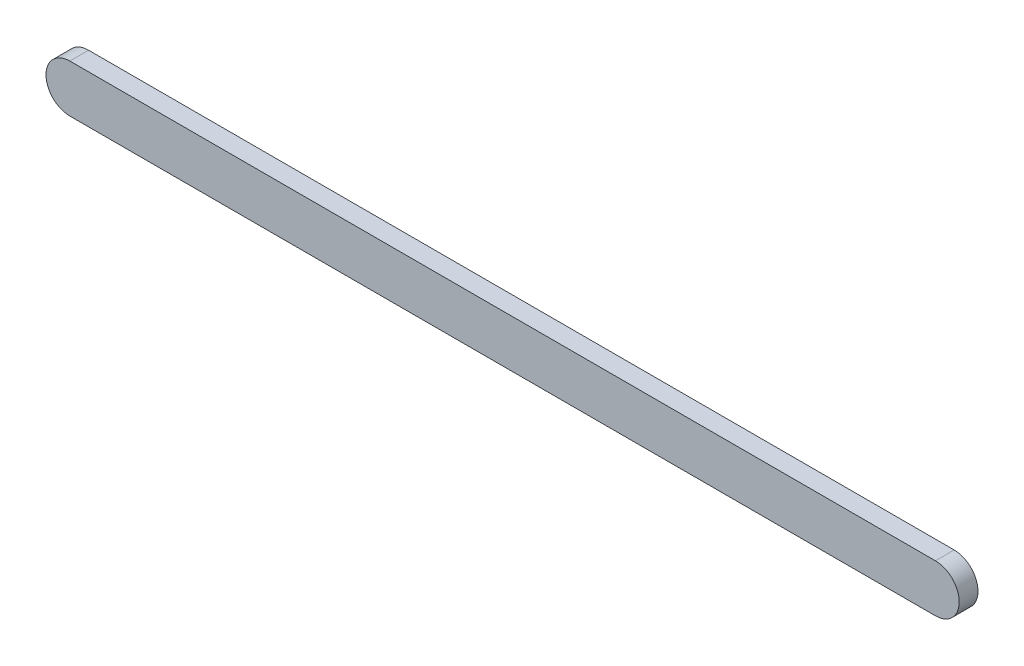
ISO-10303-21;
HEADER;
FILE_DESCRIPTION(('STEP AP214'),'2;1');
FILE_NAME('part.step','',(''),(''),'','','');
FILE_SCHEMA(('AUTOMOTIVE_DESIGN { 1 0 10303 214 1 1 1 1 }'));
ENDSEC;
DATA;
#1=APPLICATION_CONTEXT('core data for automotive mechanical design processes');
#2=APPLICATION_PROTOCOL_DEFINITION('international standard','automotive_design',2000,#1);
#3=PRODUCT_CONTEXT('',#1,'mechanical');
#4=PRODUCT('Part','Part','',(#3));
#5=PRODUCT_RELATED_PRODUCT_CATEGORY('part','',(#4));
#6=PRODUCT_DEFINITION_FORMATION('','',#4);
#7=PRODUCT_DEFINITION_CONTEXT('part definition',#1,'design');
#8=PRODUCT_DEFINITION('design','',#6,#7);
#9=PRODUCT_DEFINITION_SHAPE('','',#8);
#10=(LENGTH_UNIT() NAMED_UNIT(*) SI_UNIT(.MILLI.,.METRE.));
#11=(NAMED_UNIT(*) PLANE_ANGLE_UNIT() SI_UNIT($,.RADIAN.));
#12=(NAMED_UNIT(*) SI_UNIT($,.STERADIAN.) SOLID_ANGLE_UNIT());
#13=UNCERTAINTY_MEASURE_WITH_UNIT(LENGTH_MEASURE(1.E-05),#10,'distance_accuracy_value','');
#14=(GEOMETRIC_REPRESENTATION_CONTEXT(3) GLOBAL_UNCERTAINTY_ASSIGNED_CONTEXT((#13)) GLOBAL_UNIT_ASSIGNED_CONTEXT((#10,
#11,#12)) REPRESENTATION_CONTEXT('',''));
#15=CARTESIAN_POINT('',(0.,0.,0.));
#16=DIRECTION('',(0.,0.,1.));
#17=DIRECTION('',(1.,0.,0.));
#18=AXIS2_PLACEMENT_3D('',#15,#16,#17);
#19=CARTESIAN_POINT('',(95.29358132,52.324,0.));
#20=DIRECTION('',(0.,1.,0.));
#21=DIRECTION('',(1.,0.,0.));
#22=AXIS2_PLACEMENT_3D('',#19,#20,#21);
#23=PLANE('',#22);
#24=DIRECTION('',(1.,0.,0.));
#25=VECTOR('',#24,1.);
#26=CARTESIAN_POINT('',(95.29358132,52.324,0.1999996));
#27=LINE('',#26,#25);
#28=CARTESIAN_POINT('',(95.29358132,52.324,0.1999996));
#29=VERTEX_POINT('',#28);
#30=CARTESIAN_POINT('',(104.521,52.324,0.1999996));
#31=VERTEX_POINT('',#30);
#32=EDGE_CURVE('E11',#29,#31,#27,.T.);
#33=ORIENTED_EDGE('',*,*,#32,.F.);
#34=DIRECTION('',(0.,0.,1.));
#35=VECTOR('',#34,1.);
#36=CARTESIAN_POINT('',(95.29358132,52.324,0.));
#37=LINE('',#36,#35);
#38=CARTESIAN_POINT('',(95.29358132,52.324,0.));
#39=VERTEX_POINT('',#38);
#40=EDGE_CURVE('E24',#39,#29,#37,.T.);
#41=ORIENTED_EDGE('',*,*,#40,.F.);
#42=DIRECTION('',(1.,0.,0.));
#43=VECTOR('',#42,1.);
#44=CARTESIAN_POINT('',(95.29358132,52.324,0.));
#45=LINE('',#44,#43);
#46=CARTESIAN_POINT('',(104.521,52.324,0.));
#47=VERTEX_POINT('',#46);
#48=EDGE_CURVE('E75',#39,#47,#45,.T.);
#49=ORIENTED_EDGE('',*,*,#48,.T.);
#50=DIRECTION('',(0.,0.,1.));
#51=VECTOR('',#50,1.);
#52=CARTESIAN_POINT('',(104.521,52.324,0.));
#53=LINE('',#52,#51);
#54=EDGE_CURVE('E37',#47,#31,#53,.T.);
#55=ORIENTED_EDGE('',*,*,#54,.T.);
#56=EDGE_LOOP('',(#33,#41,#49,#55));
#57=FACE_BOUND('',#56,.T.);
#58=ADVANCED_FACE('F17',(#57),#23,.F.);
#59=CARTESIAN_POINT('',(104.521,52.578,0.));
#60=DIRECTION('',(0.,0.,-1.));
#61=DIRECTION('',(0.,-1.,0.));
#62=AXIS2_PLACEMENT_3D('',#59,#60,#61);
#63=CYLINDRICAL_SURFACE('',#62,0.254000000000003);
#64=CARTESIAN_POINT('',(104.521,52.578,0.1999996));
#65=DIRECTION('',(0.,0.,1.));
#66=DIRECTION('',(0.,-1.,0.));
#67=AXIS2_PLACEMENT_3D('',#64,#65,#66);
#68=CIRCLE('',#67,0.254000000000003);
#69=CARTESIAN_POINT('',(104.521,52.832,0.1999996));
#70=VERTEX_POINT('',#69);
#71=EDGE_CURVE('E83',#31,#70,#68,.T.);
#72=ORIENTED_EDGE('',*,*,#71,.F.);
#73=ORIENTED_EDGE('',*,*,#54,.F.);
#74=CARTESIAN_POINT('',(104.521,52.578,0.));
#75=DIRECTION('',(0.,0.,1.));
#76=DIRECTION('',(0.,-1.,0.));
#77=AXIS2_PLACEMENT_3D('',#74,#75,#76);
#78=CIRCLE('',#77,0.254000000000003);
#79=CARTESIAN_POINT('',(104.521,52.832,0.));
#80=VERTEX_POINT('',#79);
#81=EDGE_CURVE('E81',#47,#80,#78,.T.);
#82=ORIENTED_EDGE('',*,*,#81,.T.);
#83=DIRECTION('',(0.,0.,1.));
#84=VECTOR('',#83,1.);
#85=CARTESIAN_POINT('',(104.521,52.832,0.));
#86=LINE('',#85,#84);
#87=EDGE_CURVE('E67',#80,#70,#86,.T.);
#88=ORIENTED_EDGE('',*,*,#87,.T.);
#89=EDGE_LOOP('',(#72,#73,#82,#88));
#90=FACE_BOUND('',#89,.T.);
#91=ADVANCED_FACE('F89',(#90),#63,.T.);
#92=CARTESIAN_POINT('',(104.521,52.832,0.));
#93=DIRECTION('',(0.,-1.,0.));
#94=DIRECTION('',(-1.,0.,0.));
#95=AXIS2_PLACEMENT_3D('',#92,#93,#94);
#96=PLANE('',#95);
#97=DIRECTION('',(-1.,0.,0.));
#98=VECTOR('',#97,1.);
#99=CARTESIAN_POINT('',(104.521,52.832,0.1999996));
#100=LINE('',#99,#98);
#101=CARTESIAN_POINT('',(95.29358132,52.832,0.1999996));
#102=VERTEX_POINT('',#101);
#103=EDGE_CURVE('E71',#70,#102,#100,.T.);
#104=ORIENTED_EDGE('',*,*,#103,.F.);
#105=ORIENTED_EDGE('',*,*,#87,.F.);
#106=DIRECTION('',(-1.,0.,0.));
#107=VECTOR('',#106,1.);
#108=CARTESIAN_POINT('',(104.521,52.832,0.));
#109=LINE('',#108,#107);
#110=CARTESIAN_POINT('',(95.29358132,52.832,0.));
#111=VERTEX_POINT('',#110);
#112=EDGE_CURVE('E63',#80,#111,#109,.T.);
#113=ORIENTED_EDGE('',*,*,#112,.T.);
#114=DIRECTION('',(0.,0.,1.));
#115=VECTOR('',#114,1.);
#116=CARTESIAN_POINT('',(95.29358132,52.832,0.));
#117=LINE('',#116,#115);
#118=EDGE_CURVE('E53',#111,#102,#117,.T.);
#119=ORIENTED_EDGE('',*,*,#118,.T.);
#120=EDGE_LOOP('',(#104,#105,#113,#119));
#121=FACE_BOUND('',#120,.T.);
#122=ADVANCED_FACE('F66',(#121),#96,.F.);
#123=CARTESIAN_POINT('',(95.29358132,52.578,0.));
#124=DIRECTION('',(0.,0.,-1.));
#125=DIRECTION('',(0.,1.,0.));
#126=AXIS2_PLACEMENT_3D('',#123,#124,#125);
#127=CYLINDRICAL_SURFACE('',#126,0.254000000000003);
#128=CARTESIAN_POINT('',(95.29358132,52.578,0.1999996));
#129=DIRECTION('',(0.,0.,1.));
#130=DIRECTION('',(0.,1.,0.));
#131=AXIS2_PLACEMENT_3D('',#128,#129,#130);
#132=CIRCLE('',#131,0.254000000000003);
#133=EDGE_CURVE('E59',#102,#29,#132,.T.);
#134=ORIENTED_EDGE('',*,*,#133,.F.);
#135=ORIENTED_EDGE('',*,*,#118,.F.);
#136=CARTESIAN_POINT('',(95.29358132,52.578,0.));
#137=DIRECTION('',(0.,0.,1.));
#138=DIRECTION('',(0.,1.,0.));
#139=AXIS2_PLACEMENT_3D('',#136,#137,#138);
#140=CIRCLE('',#139,0.254000000000003);
#141=EDGE_CURVE('E57',#111,#39,#140,.T.);
#142=ORIENTED_EDGE('',*,*,#141,.T.);
#143=ORIENTED_EDGE('',*,*,#40,.T.);
#144=EDGE_LOOP('',(#134,#135,#142,#143));
#145=FACE_BOUND('',#144,.T.);
#146=ADVANCED_FACE('F55',(#145),#127,.T.);
#147=CARTESIAN_POINT('',(95.29358132,52.324,0.));
#148=DIRECTION('',(0.,0.,-1.));
#149=DIRECTION('',(-1.,0.,0.));
#150=AXIS2_PLACEMENT_3D('',#147,#148,#149);
#151=PLANE('',#150);
#152=ORIENTED_EDGE('',*,*,#141,.F.);
#153=ORIENTED_EDGE('',*,*,#112,.F.);
#154=ORIENTED_EDGE('',*,*,#81,.F.);
#155=ORIENTED_EDGE('',*,*,#48,.F.);
#156=EDGE_LOOP('',(#152,#153,#154,#155));
#157=FACE_BOUND('',#156,.T.);
#158=ADVANCED_FACE('F74',(#157),#151,.T.);
#159=CARTESIAN_POINT('',(95.29358132,52.324,0.1999996));
#160=DIRECTION('',(0.,0.,-1.));
#161=DIRECTION('',(-1.,0.,0.));
#162=AXIS2_PLACEMENT_3D('',#159,#160,#161);
#163=PLANE('',#162);
#164=ORIENTED_EDGE('',*,*,#32,.T.);
#165=ORIENTED_EDGE('',*,*,#71,.T.);
#166=ORIENTED_EDGE('',*,*,#103,.T.);
#167=ORIENTED_EDGE('',*,*,#133,.T.);
#168=EDGE_LOOP('',(#164,#165,#166,#167));
#169=FACE_BOUND('',#168,.T.);
#170=ADVANCED_FACE('F91',(#169),#163,.F.);
#171=CLOSED_SHELL('',(#58,#91,#122,#146,#158,#170));
#172=MANIFOLD_SOLID_BREP('B1',#171);
#173=ADVANCED_BREP_SHAPE_REPRESENTATION('',(#18,#172),#14);
#174=SHAPE_DEFINITION_REPRESENTATION(#9,#173);
ENDSEC;
END-ISO-10303-21;
